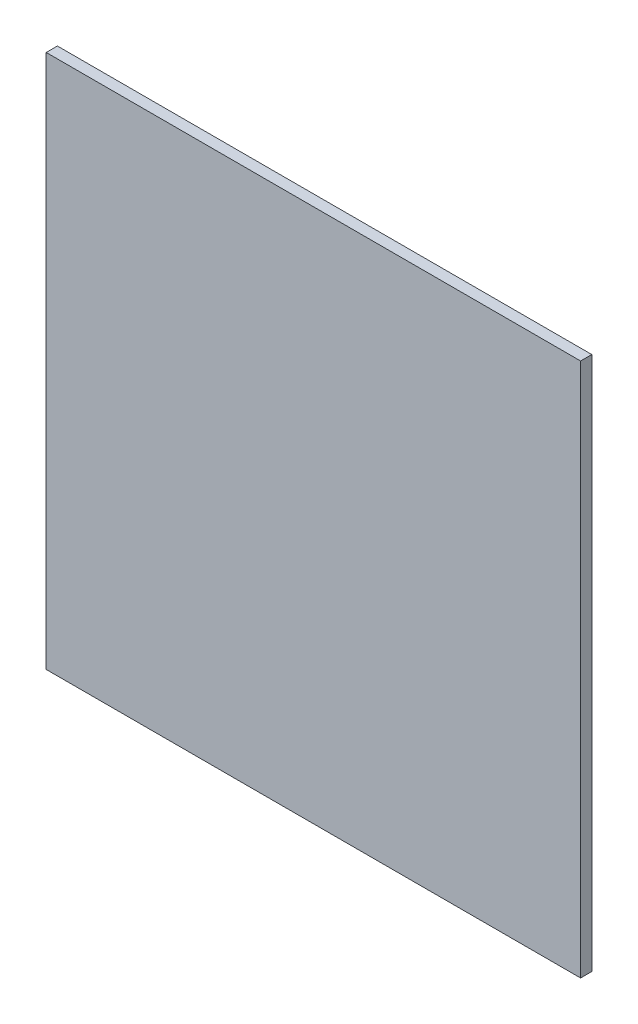
ISO-10303-21;
HEADER;
FILE_DESCRIPTION(('STEP AP214'),'2;1');
FILE_NAME('part.step','',(''),(''),'','','');
FILE_SCHEMA(('AUTOMOTIVE_DESIGN { 1 0 10303 214 1 1 1 1 }'));
ENDSEC;
DATA;
#1=APPLICATION_CONTEXT('core data for automotive mechanical design processes');
#2=APPLICATION_PROTOCOL_DEFINITION('international standard','automotive_design',2000,#1);
#3=PRODUCT_CONTEXT('',#1,'mechanical');
#4=PRODUCT('Part','Part','',(#3));
#5=PRODUCT_RELATED_PRODUCT_CATEGORY('part','',(#4));
#6=PRODUCT_DEFINITION_FORMATION('','',#4);
#7=PRODUCT_DEFINITION_CONTEXT('part definition',#1,'design');
#8=PRODUCT_DEFINITION('design','',#6,#7);
#9=PRODUCT_DEFINITION_SHAPE('','',#8);
#10=(LENGTH_UNIT() NAMED_UNIT(*) SI_UNIT(.MILLI.,.METRE.));
#11=(NAMED_UNIT(*) PLANE_ANGLE_UNIT() SI_UNIT($,.RADIAN.));
#12=(NAMED_UNIT(*) SI_UNIT($,.STERADIAN.) SOLID_ANGLE_UNIT());
#13=UNCERTAINTY_MEASURE_WITH_UNIT(LENGTH_MEASURE(1.E-05),#10,'distance_accuracy_value','');
#14=(GEOMETRIC_REPRESENTATION_CONTEXT(3) GLOBAL_UNCERTAINTY_ASSIGNED_CONTEXT((#13)) GLOBAL_UNIT_ASSIGNED_CONTEXT((#10,
#11,#12)) REPRESENTATION_CONTEXT('',''));
#15=CARTESIAN_POINT('',(0.,0.,0.));
#16=DIRECTION('',(0.,0.,1.));
#17=DIRECTION('',(1.,0.,0.));
#18=AXIS2_PLACEMENT_3D('',#15,#16,#17);
#19=CARTESIAN_POINT('',(151.765,151.765,6.35));
#20=DIRECTION('',(-1.,0.,0.));
#21=DIRECTION('',(0.,-1.,0.));
#22=AXIS2_PLACEMENT_3D('',#19,#20,#21);
#23=PLANE('',#22);
#24=DIRECTION('',(0.,1.,0.));
#25=VECTOR('',#24,1.);
#26=CARTESIAN_POINT('',(151.765,151.765,0.));
#27=LINE('',#26,#25);
#28=CARTESIAN_POINT('',(151.765,-151.765,0.));
#29=VERTEX_POINT('',#28);
#30=CARTESIAN_POINT('',(151.765,151.765,0.));
#31=VERTEX_POINT('',#30);
#32=EDGE_CURVE('E109',#29,#31,#27,.T.);
#33=ORIENTED_EDGE('',*,*,#32,.T.);
#34=DIRECTION('',(0.,0.,-1.));
#35=VECTOR('',#34,1.);
#36=CARTESIAN_POINT('',(151.765,151.765,6.35));
#37=LINE('',#36,#35);
#38=CARTESIAN_POINT('',(151.765,151.765,6.35));
#39=VERTEX_POINT('',#38);
#40=EDGE_CURVE('E11',#39,#31,#37,.T.);
#41=ORIENTED_EDGE('',*,*,#40,.F.);
#42=DIRECTION('',(0.,1.,0.));
#43=VECTOR('',#42,1.);
#44=CARTESIAN_POINT('',(151.765,151.765,6.35));
#45=LINE('',#44,#43);
#46=CARTESIAN_POINT('',(151.765,-151.765,6.35));
#47=VERTEX_POINT('',#46);
#48=EDGE_CURVE('E93',#47,#39,#45,.T.);
#49=ORIENTED_EDGE('',*,*,#48,.F.);
#50=DIRECTION('',(0.,0.,-1.));
#51=VECTOR('',#50,1.);
#52=CARTESIAN_POINT('',(151.765,-151.765,6.35));
#53=LINE('',#52,#51);
#54=EDGE_CURVE('E105',#47,#29,#53,.T.);
#55=ORIENTED_EDGE('',*,*,#54,.T.);
#56=EDGE_LOOP('',(#33,#41,#49,#55));
#57=FACE_BOUND('',#56,.T.);
#58=ADVANCED_FACE('F41',(#57),#23,.F.);
#59=CARTESIAN_POINT('',(-151.765,151.765,6.35));
#60=DIRECTION('',(0.,-1.,0.));
#61=DIRECTION('',(0.,0.,-1.));
#62=AXIS2_PLACEMENT_3D('',#59,#60,#61);
#63=PLANE('',#62);
#64=DIRECTION('',(-1.,0.,0.));
#65=VECTOR('',#64,1.);
#66=CARTESIAN_POINT('',(-151.765,151.765,0.));
#67=LINE('',#66,#65);
#68=CARTESIAN_POINT('',(-151.765,151.765,0.));
#69=VERTEX_POINT('',#68);
#70=EDGE_CURVE('E98',#31,#69,#67,.T.);
#71=ORIENTED_EDGE('',*,*,#70,.T.);
#72=DIRECTION('',(0.,0.,-1.));
#73=VECTOR('',#72,1.);
#74=CARTESIAN_POINT('',(-151.765,151.765,6.35));
#75=LINE('',#74,#73);
#76=CARTESIAN_POINT('',(-151.765,151.765,6.35));
#77=VERTEX_POINT('',#76);
#78=EDGE_CURVE('E50',#77,#69,#75,.T.);
#79=ORIENTED_EDGE('',*,*,#78,.F.);
#80=DIRECTION('',(-1.,0.,0.));
#81=VECTOR('',#80,1.);
#82=CARTESIAN_POINT('',(-151.765,151.765,6.35));
#83=LINE('',#82,#81);
#84=EDGE_CURVE('E88',#39,#77,#83,.T.);
#85=ORIENTED_EDGE('',*,*,#84,.F.);
#86=ORIENTED_EDGE('',*,*,#40,.T.);
#87=EDGE_LOOP('',(#71,#79,#85,#86));
#88=FACE_BOUND('',#87,.T.);
#89=ADVANCED_FACE('F97',(#88),#63,.F.);
#90=CARTESIAN_POINT('',(-151.765,151.765,6.35));
#91=DIRECTION('',(1.,0.,0.));
#92=DIRECTION('',(0.,1.,0.));
#93=AXIS2_PLACEMENT_3D('',#90,#91,#92);
#94=PLANE('',#93);
#95=DIRECTION('',(0.,-1.,0.));
#96=VECTOR('',#95,1.);
#97=CARTESIAN_POINT('',(-151.765,151.765,0.));
#98=LINE('',#97,#96);
#99=CARTESIAN_POINT('',(-151.765,-151.765,0.));
#100=VERTEX_POINT('',#99);
#101=EDGE_CURVE('E75',#69,#100,#98,.T.);
#102=ORIENTED_EDGE('',*,*,#101,.T.);
#103=DIRECTION('',(0.,0.,-1.));
#104=VECTOR('',#103,1.);
#105=CARTESIAN_POINT('',(-151.765,-151.765,6.35));
#106=LINE('',#105,#104);
#107=CARTESIAN_POINT('',(-151.765,-151.765,6.35));
#108=VERTEX_POINT('',#107);
#109=EDGE_CURVE('E100',#108,#100,#106,.T.);
#110=ORIENTED_EDGE('',*,*,#109,.F.);
#111=DIRECTION('',(0.,-1.,0.));
#112=VECTOR('',#111,1.);
#113=CARTESIAN_POINT('',(-151.765,151.765,6.35));
#114=LINE('',#113,#112);
#115=EDGE_CURVE('E91',#77,#108,#114,.T.);
#116=ORIENTED_EDGE('',*,*,#115,.F.);
#117=ORIENTED_EDGE('',*,*,#78,.T.);
#118=EDGE_LOOP('',(#102,#110,#116,#117));
#119=FACE_BOUND('',#118,.T.);
#120=ADVANCED_FACE('F101',(#119),#94,.F.);
#121=CARTESIAN_POINT('',(-151.765,-151.765,6.35));
#122=DIRECTION('',(0.,1.,0.));
#123=DIRECTION('',(0.,0.,1.));
#124=AXIS2_PLACEMENT_3D('',#121,#122,#123);
#125=PLANE('',#124);
#126=DIRECTION('',(1.,0.,0.));
#127=VECTOR('',#126,1.);
#128=CARTESIAN_POINT('',(-151.765,-151.765,0.));
#129=LINE('',#128,#127);
#130=EDGE_CURVE('E81',#100,#29,#129,.T.);
#131=ORIENTED_EDGE('',*,*,#130,.T.);
#132=ORIENTED_EDGE('',*,*,#54,.F.);
#133=DIRECTION('',(1.,0.,0.));
#134=VECTOR('',#133,1.);
#135=CARTESIAN_POINT('',(-151.765,-151.765,6.35));
#136=LINE('',#135,#134);
#137=EDGE_CURVE('E58',#108,#47,#136,.T.);
#138=ORIENTED_EDGE('',*,*,#137,.F.);
#139=ORIENTED_EDGE('',*,*,#109,.T.);
#140=EDGE_LOOP('',(#131,#132,#138,#139));
#141=FACE_BOUND('',#140,.T.);
#142=ADVANCED_FACE('F122',(#141),#125,.F.);
#143=CARTESIAN_POINT('',(0.,0.,6.35));
#144=DIRECTION('',(0.,0.,1.));
#145=DIRECTION('',(1.,0.,0.));
#146=AXIS2_PLACEMENT_3D('',#143,#144,#145);
#147=PLANE('',#146);
#148=ORIENTED_EDGE('',*,*,#48,.T.);
#149=ORIENTED_EDGE('',*,*,#84,.T.);
#150=ORIENTED_EDGE('',*,*,#115,.T.);
#151=ORIENTED_EDGE('',*,*,#137,.T.);
#152=EDGE_LOOP('',(#148,#149,#150,#151));
#153=FACE_BOUND('',#152,.T.);
#154=ADVANCED_FACE('F89',(#153),#147,.T.);
#155=CARTESIAN_POINT('',(0.,0.,0.));
#156=DIRECTION('',(0.,0.,1.));
#157=DIRECTION('',(1.,0.,0.));
#158=AXIS2_PLACEMENT_3D('',#155,#156,#157);
#159=PLANE('',#158);
#160=ORIENTED_EDGE('',*,*,#32,.F.);
#161=ORIENTED_EDGE('',*,*,#130,.F.);
#162=ORIENTED_EDGE('',*,*,#101,.F.);
#163=ORIENTED_EDGE('',*,*,#70,.F.);
#164=EDGE_LOOP('',(#160,#161,#162,#163));
#165=FACE_BOUND('',#164,.T.);
#166=ADVANCED_FACE('F125',(#165),#159,.F.);
#167=CLOSED_SHELL('',(#58,#89,#120,#142,#154,#166));
#168=MANIFOLD_SOLID_BREP('B2',#167);
#169=ADVANCED_BREP_SHAPE_REPRESENTATION('',(#18,#168),#14);
#170=SHAPE_DEFINITION_REPRESENTATION(#9,#169);
ENDSEC;
END-ISO-10303-21;
